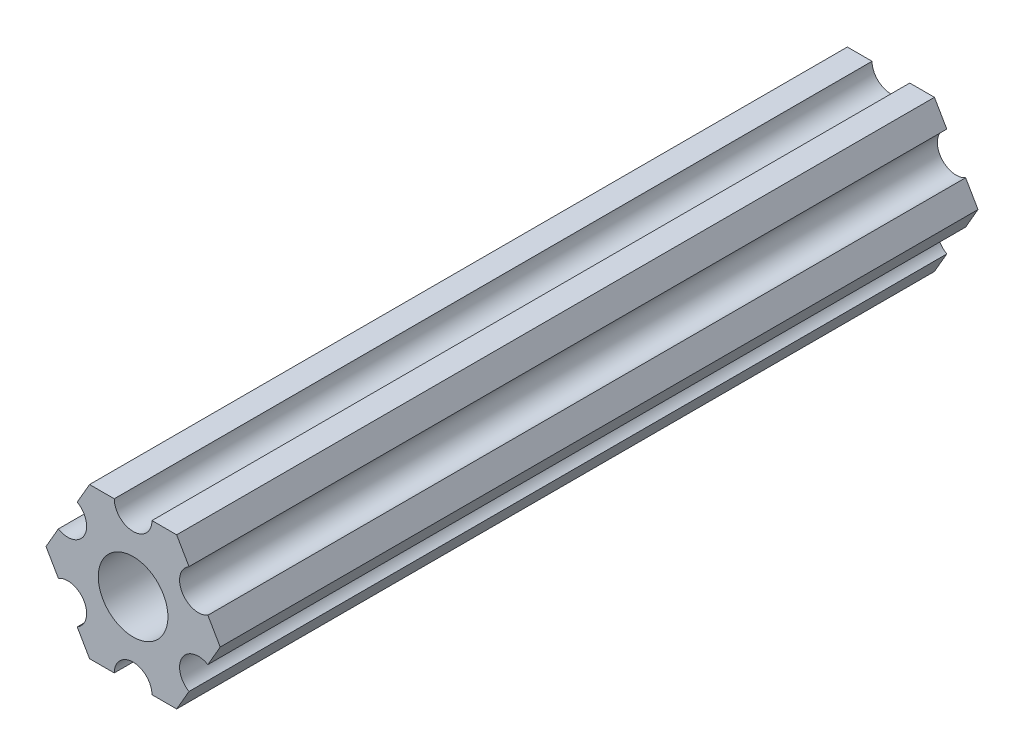
ISO-10303-21;
HEADER;
FILE_DESCRIPTION(('STEP AP214'),'2;1');
FILE_NAME('part.step','',(''),(''),'','','');
FILE_SCHEMA(('AUTOMOTIVE_DESIGN { 1 0 10303 214 1 1 1 1 }'));
ENDSEC;
DATA;
#1=APPLICATION_CONTEXT('core data for automotive mechanical design processes');
#2=APPLICATION_PROTOCOL_DEFINITION('international standard','automotive_design',2000,#1);
#3=PRODUCT_CONTEXT('',#1,'mechanical');
#4=PRODUCT('Part','Part','',(#3));
#5=PRODUCT_RELATED_PRODUCT_CATEGORY('part','',(#4));
#6=PRODUCT_DEFINITION_FORMATION('','',#4);
#7=PRODUCT_DEFINITION_CONTEXT('part definition',#1,'design');
#8=PRODUCT_DEFINITION('design','',#6,#7);
#9=PRODUCT_DEFINITION_SHAPE('','',#8);
#10=(LENGTH_UNIT() NAMED_UNIT(*) SI_UNIT(.MILLI.,.METRE.));
#11=(NAMED_UNIT(*) PLANE_ANGLE_UNIT() SI_UNIT($,.RADIAN.));
#12=(NAMED_UNIT(*) SI_UNIT($,.STERADIAN.) SOLID_ANGLE_UNIT());
#13=UNCERTAINTY_MEASURE_WITH_UNIT(LENGTH_MEASURE(1.E-05),#10,'distance_accuracy_value','');
#14=(GEOMETRIC_REPRESENTATION_CONTEXT(3) GLOBAL_UNCERTAINTY_ASSIGNED_CONTEXT((#13)) GLOBAL_UNIT_ASSIGNED_CONTEXT((#10,
#11,#12)) REPRESENTATION_CONTEXT('',''));
#15=CARTESIAN_POINT('',(0.,0.,0.));
#16=DIRECTION('',(0.,0.,1.));
#17=DIRECTION('',(1.,0.,0.));
#18=AXIS2_PLACEMENT_3D('',#15,#16,#17);
#19=CARTESIAN_POINT('',(5.49926150638083,-3.17499966684068,63.79));
#20=DIRECTION('',(0.,0.,-1.));
#21=DIRECTION('',(-1.,0.,0.));
#22=AXIS2_PLACEMENT_3D('',#19,#20,#21);
#23=CYLINDRICAL_SURFACE('',#22,1.58750000000001);
#24=CARTESIAN_POINT('',(5.49926150638083,-3.17499966684068,0.));
#25=DIRECTION('',(0.,0.,1.));
#26=DIRECTION('',(1.,0.,0.));
#27=AXIS2_PLACEMENT_3D('',#24,#25,#26);
#28=CIRCLE('',#27,1.58750000000001);
#29=CARTESIAN_POINT('',(6.29301142309098,-1.80018429024546,0.));
#30=VERTEX_POINT('',#29);
#31=CARTESIAN_POINT('',(4.70551158967068,-4.54981504343589,0.));
#32=VERTEX_POINT('',#31);
#33=EDGE_CURVE('E190',#30,#32,#28,.T.);
#34=ORIENTED_EDGE('',*,*,#33,.F.);
#35=DIRECTION('',(0.,0.,-1.));
#36=VECTOR('',#35,1.);
#37=CARTESIAN_POINT('',(6.29301142309098,-1.80018429024546,63.79));
#38=LINE('',#37,#36);
#39=CARTESIAN_POINT('',(6.29301142309098,-1.80018429024546,63.79));
#40=VERTEX_POINT('',#39);
#41=EDGE_CURVE('E11',#40,#30,#38,.T.);
#42=ORIENTED_EDGE('',*,*,#41,.F.);
#43=CARTESIAN_POINT('',(5.49926150638083,-3.17499966684068,63.79));
#44=DIRECTION('',(0.,0.,1.));
#45=DIRECTION('',(1.,0.,0.));
#46=AXIS2_PLACEMENT_3D('',#43,#44,#45);
#47=CIRCLE('',#46,1.58750000000001);
#48=CARTESIAN_POINT('',(4.70551158967068,-4.54981504343589,63.79));
#49=VERTEX_POINT('',#48);
#50=EDGE_CURVE('E241',#40,#49,#47,.T.);
#51=ORIENTED_EDGE('',*,*,#50,.T.);
#52=DIRECTION('',(0.,0.,-1.));
#53=VECTOR('',#52,1.);
#54=CARTESIAN_POINT('',(4.70551158967068,-4.54981504343589,63.79));
#55=LINE('',#54,#53);
#56=EDGE_CURVE('E36',#49,#32,#55,.T.);
#57=ORIENTED_EDGE('',*,*,#56,.T.);
#58=EDGE_LOOP('',(#34,#42,#51,#57));
#59=FACE_BOUND('',#58,.T.);
#60=ADVANCED_FACE('F33',(#59),#23,.F.);
#61=CARTESIAN_POINT('',(7.33234841870826,4.44212518856872E-07,63.79));
#62=DIRECTION('',(0.866025434075723,-0.499999947533953,0.));
#63=DIRECTION('',(0.499999947533953,0.866025434075723,0.));
#64=AXIS2_PLACEMENT_3D('',#61,#62,#63);
#65=PLANE('',#64);
#66=DIRECTION('',(-0.499999947533953,-0.866025434075723,0.));
#67=VECTOR('',#66,1.);
#68=CARTESIAN_POINT('',(7.33234841870826,4.44212518856872E-07,0.));
#69=LINE('',#68,#67);
#70=CARTESIAN_POINT('',(7.33234841870826,4.44212518856872E-07,0.));
#71=VERTEX_POINT('',#70);
#72=EDGE_CURVE('E239',#71,#30,#69,.T.);
#73=ORIENTED_EDGE('',*,*,#72,.F.);
#74=DIRECTION('',(0.,0.,-1.));
#75=VECTOR('',#74,1.);
#76=CARTESIAN_POINT('',(7.33234841870826,4.44212518856872E-07,63.79));
#77=LINE('',#76,#75);
#78=CARTESIAN_POINT('',(7.33234841870826,4.44212518856872E-07,63.79));
#79=VERTEX_POINT('',#78);
#80=EDGE_CURVE('E42',#79,#71,#77,.T.);
#81=ORIENTED_EDGE('',*,*,#80,.F.);
#82=DIRECTION('',(-0.499999947533953,-0.866025434075723,0.));
#83=VECTOR('',#82,1.);
#84=CARTESIAN_POINT('',(7.33234841870826,4.44212518856872E-07,63.79));
#85=LINE('',#84,#83);
#86=EDGE_CURVE('E180',#79,#40,#85,.T.);
#87=ORIENTED_EDGE('',*,*,#86,.T.);
#88=ORIENTED_EDGE('',*,*,#41,.T.);
#89=EDGE_LOOP('',(#73,#81,#87,#88));
#90=FACE_BOUND('',#89,.T.);
#91=ADVANCED_FACE('F273',(#90),#65,.T.);
#92=CARTESIAN_POINT('',(6.29301120497139,1.80018505273895,63.79));
#93=DIRECTION('',(0.866025373493145,0.500000052466056,0.));
#94=DIRECTION('',(-0.500000052466056,0.866025373493145,0.));
#95=AXIS2_PLACEMENT_3D('',#92,#93,#94);
#96=PLANE('',#95);
#97=DIRECTION('',(0.500000052466056,-0.866025373493145,0.));
#98=VECTOR('',#97,1.);
#99=CARTESIAN_POINT('',(6.29301120497139,1.80018505273895,0.));
#100=LINE('',#99,#98);
#101=CARTESIAN_POINT('',(6.29301120497139,1.80018505273895,0.));
#102=VERTEX_POINT('',#101);
#103=EDGE_CURVE('E167',#102,#71,#100,.T.);
#104=ORIENTED_EDGE('',*,*,#103,.F.);
#105=DIRECTION('',(0.,0.,-1.));
#106=VECTOR('',#105,1.);
#107=CARTESIAN_POINT('',(6.29301120497139,1.80018505273895,63.79));
#108=LINE('',#107,#106);
#109=CARTESIAN_POINT('',(6.29301120497139,1.80018505273895,63.79));
#110=VERTEX_POINT('',#109);
#111=EDGE_CURVE('E162',#110,#102,#108,.T.);
#112=ORIENTED_EDGE('',*,*,#111,.F.);
#113=DIRECTION('',(0.500000052466056,-0.866025373493145,0.));
#114=VECTOR('',#113,1.);
#115=CARTESIAN_POINT('',(6.29301120497139,1.80018505273895,63.79));
#116=LINE('',#115,#114);
#117=EDGE_CURVE('E165',#110,#79,#116,.T.);
#118=ORIENTED_EDGE('',*,*,#117,.T.);
#119=ORIENTED_EDGE('',*,*,#80,.T.);
#120=EDGE_LOOP('',(#104,#112,#118,#119));
#121=FACE_BOUND('',#120,.T.);
#122=ADVANCED_FACE('F164',(#121),#96,.T.);
#123=CARTESIAN_POINT('',(5.49926112168152,3.17500033315931,63.79));
#124=DIRECTION('',(0.,0.,-1.));
#125=DIRECTION('',(-1.,0.,0.));
#126=AXIS2_PLACEMENT_3D('',#123,#124,#125);
#127=CYLINDRICAL_SURFACE('',#126,1.5875);
#128=CARTESIAN_POINT('',(5.49926112168152,3.17500033315931,0.));
#129=DIRECTION('',(0.,0.,1.));
#130=DIRECTION('',(1.,0.,0.));
#131=AXIS2_PLACEMENT_3D('',#128,#129,#130);
#132=CIRCLE('',#131,1.5875);
#133=CARTESIAN_POINT('',(4.70551103839166,4.54981561357968,0.));
#134=VERTEX_POINT('',#133);
#135=EDGE_CURVE('E236',#134,#102,#132,.T.);
#136=ORIENTED_EDGE('',*,*,#135,.F.);
#137=DIRECTION('',(0.,0.,-1.));
#138=VECTOR('',#137,1.);
#139=CARTESIAN_POINT('',(4.70551103839166,4.54981561357968,63.79));
#140=LINE('',#139,#138);
#141=CARTESIAN_POINT('',(4.70551103839166,4.54981561357968,63.79));
#142=VERTEX_POINT('',#141);
#143=EDGE_CURVE('E172',#142,#134,#140,.T.);
#144=ORIENTED_EDGE('',*,*,#143,.F.);
#145=CARTESIAN_POINT('',(5.49926112168152,3.17500033315931,63.79));
#146=DIRECTION('',(0.,0.,1.));
#147=DIRECTION('',(1.,0.,0.));
#148=AXIS2_PLACEMENT_3D('',#145,#146,#147);
#149=CIRCLE('',#148,1.5875);
#150=EDGE_CURVE('E178',#142,#110,#149,.T.);
#151=ORIENTED_EDGE('',*,*,#150,.T.);
#152=ORIENTED_EDGE('',*,*,#111,.T.);
#153=EDGE_LOOP('',(#136,#144,#151,#152));
#154=FACE_BOUND('',#153,.T.);
#155=ADVANCED_FACE('F182',(#154),#127,.F.);
#156=CARTESIAN_POINT('',(3.66617382465472,6.35000022210622,63.79));
#157=DIRECTION('',(0.866025373493145,0.500000052466056,0.));
#158=DIRECTION('',(-0.500000052466056,0.866025373493145,0.));
#159=AXIS2_PLACEMENT_3D('',#156,#157,#158);
#160=PLANE('',#159);
#161=DIRECTION('',(0.500000052466056,-0.866025373493145,0.));
#162=VECTOR('',#161,1.);
#163=CARTESIAN_POINT('',(3.66617382465472,6.35000022210622,0.));
#164=LINE('',#163,#162);
#165=CARTESIAN_POINT('',(3.66617382465472,6.35000022210622,0.));
#166=VERTEX_POINT('',#165);
#167=EDGE_CURVE('E233',#166,#134,#164,.T.);
#168=ORIENTED_EDGE('',*,*,#167,.F.);
#169=DIRECTION('',(0.,0.,-1.));
#170=VECTOR('',#169,1.);
#171=CARTESIAN_POINT('',(3.66617382465472,6.35000022210622,63.79));
#172=LINE('',#171,#170);
#173=CARTESIAN_POINT('',(3.66617382465472,6.35000022210622,63.79));
#174=VERTEX_POINT('',#173);
#175=EDGE_CURVE('E245',#174,#166,#172,.T.);
#176=ORIENTED_EDGE('',*,*,#175,.F.);
#177=DIRECTION('',(0.500000052466056,-0.866025373493145,0.));
#178=VECTOR('',#177,1.);
#179=CARTESIAN_POINT('',(3.66617382465472,6.35000022210622,63.79));
#180=LINE('',#179,#178);
#181=EDGE_CURVE('E183',#174,#142,#180,.T.);
#182=ORIENTED_EDGE('',*,*,#181,.T.);
#183=ORIENTED_EDGE('',*,*,#143,.T.);
#184=EDGE_LOOP('',(#168,#176,#182,#183));
#185=FACE_BOUND('',#184,.T.);
#186=ADVANCED_FACE('F286',(#185),#160,.T.);
#187=CARTESIAN_POINT('',(1.58749961530066,6.35000022210623,63.79));
#188=DIRECTION('',(0.,1.,0.));
#189=DIRECTION('',(-1.,0.,0.));
#190=AXIS2_PLACEMENT_3D('',#187,#188,#189);
#191=PLANE('',#190);
#192=DIRECTION('',(1.,0.,0.));
#193=VECTOR('',#192,1.);
#194=CARTESIAN_POINT('',(1.58749961530066,6.35000022210623,0.));
#195=LINE('',#194,#193);
#196=CARTESIAN_POINT('',(1.58749961530066,6.35000022210623,0.));
#197=VERTEX_POINT('',#196);
#198=EDGE_CURVE('E230',#197,#166,#195,.T.);
#199=ORIENTED_EDGE('',*,*,#198,.F.);
#200=DIRECTION('',(0.,0.,-1.));
#201=VECTOR('',#200,1.);
#202=CARTESIAN_POINT('',(1.58749961530066,6.35000022210623,63.79));
#203=LINE('',#202,#201);
#204=CARTESIAN_POINT('',(1.58749961530066,6.35000022210623,63.79));
#205=VERTEX_POINT('',#204);
#206=EDGE_CURVE('E247',#205,#197,#203,.T.);
#207=ORIENTED_EDGE('',*,*,#206,.F.);
#208=DIRECTION('',(1.,0.,0.));
#209=VECTOR('',#208,1.);
#210=CARTESIAN_POINT('',(1.58749961530066,6.35000022210623,63.79));
#211=LINE('',#210,#209);
#212=EDGE_CURVE('E185',#205,#174,#211,.T.);
#213=ORIENTED_EDGE('',*,*,#212,.T.);
#214=ORIENTED_EDGE('',*,*,#175,.T.);
#215=EDGE_LOOP('',(#199,#207,#213,#214));
#216=FACE_BOUND('',#215,.T.);
#217=ADVANCED_FACE('F289',(#216),#191,.T.);
#218=CARTESIAN_POINT('',(-3.84699344941095E-07,6.35000022210623,63.79));
#219=DIRECTION('',(0.,0.,-1.));
#220=DIRECTION('',(-1.,0.,0.));
#221=AXIS2_PLACEMENT_3D('',#218,#219,#220);
#222=CYLINDRICAL_SURFACE('',#221,1.5875);
#223=CARTESIAN_POINT('',(-3.84699344941095E-07,6.35000022210623,0.));
#224=DIRECTION('',(0.,0.,1.));
#225=DIRECTION('',(1.,0.,0.));
#226=AXIS2_PLACEMENT_3D('',#223,#224,#225);
#227=CIRCLE('',#226,1.5875);
#228=CARTESIAN_POINT('',(-1.58750038469935,6.35000022210623,0.));
#229=VERTEX_POINT('',#228);
#230=EDGE_CURVE('E227',#229,#197,#227,.T.);
#231=ORIENTED_EDGE('',*,*,#230,.F.);
#232=DIRECTION('',(0.,0.,-1.));
#233=VECTOR('',#232,1.);
#234=CARTESIAN_POINT('',(-1.58750038469935,6.35000022210623,63.79));
#235=LINE('',#234,#233);
#236=CARTESIAN_POINT('',(-1.58750038469935,6.35000022210623,63.79));
#237=VERTEX_POINT('',#236);
#238=EDGE_CURVE('E249',#237,#229,#235,.T.);
#239=ORIENTED_EDGE('',*,*,#238,.F.);
#240=CARTESIAN_POINT('',(-3.84699344941095E-07,6.35000022210623,63.79));
#241=DIRECTION('',(0.,0.,1.));
#242=DIRECTION('',(1.,0.,0.));
#243=AXIS2_PLACEMENT_3D('',#240,#241,#242);
#244=CIRCLE('',#243,1.5875);
#245=EDGE_CURVE('E394',#237,#205,#244,.T.);
#246=ORIENTED_EDGE('',*,*,#245,.T.);
#247=ORIENTED_EDGE('',*,*,#206,.T.);
#248=EDGE_LOOP('',(#231,#239,#246,#247));
#249=FACE_BOUND('',#248,.T.);
#250=ADVANCED_FACE('F293',(#249),#222,.F.);
#251=CARTESIAN_POINT('',(-3.66617452134701,6.35000022210623,63.79));
#252=DIRECTION('',(0.,1.,0.));
#253=DIRECTION('',(0.,0.,1.));
#254=AXIS2_PLACEMENT_3D('',#251,#252,#253);
#255=PLANE('',#254);
#256=DIRECTION('',(1.,0.,0.));
#257=VECTOR('',#256,1.);
#258=CARTESIAN_POINT('',(-3.66617452134701,6.35000022210623,0.));
#259=LINE('',#258,#257);
#260=CARTESIAN_POINT('',(-3.66617452134701,6.35000022210623,0.));
#261=VERTEX_POINT('',#260);
#262=EDGE_CURVE('E224',#261,#229,#259,.T.);
#263=ORIENTED_EDGE('',*,*,#262,.F.);
#264=DIRECTION('',(0.,0.,-1.));
#265=VECTOR('',#264,1.);
#266=CARTESIAN_POINT('',(-3.66617452134701,6.35000022210623,63.79));
#267=LINE('',#266,#265);
#268=CARTESIAN_POINT('',(-3.66617452134701,6.35000022210623,63.79));
#269=VERTEX_POINT('',#268);
#270=EDGE_CURVE('E251',#269,#261,#267,.T.);
#271=ORIENTED_EDGE('',*,*,#270,.F.);
#272=DIRECTION('',(1.,0.,0.));
#273=VECTOR('',#272,1.);
#274=CARTESIAN_POINT('',(-3.66617452134701,6.35000022210623,63.79));
#275=LINE('',#274,#273);
#276=EDGE_CURVE('E391',#269,#237,#275,.T.);
#277=ORIENTED_EDGE('',*,*,#276,.T.);
#278=ORIENTED_EDGE('',*,*,#238,.T.);
#279=EDGE_LOOP('',(#263,#271,#277,#278));
#280=FACE_BOUND('',#279,.T.);
#281=ADVANCED_FACE('F297',(#280),#255,.T.);
#282=CARTESIAN_POINT('',(-4.70551145677116,4.54981548085265,63.79));
#283=DIRECTION('',(-0.866025447431971,0.499999924400249,0.));
#284=DIRECTION('',(-0.499999924400249,-0.866025447431971,0.));
#285=AXIS2_PLACEMENT_3D('',#282,#283,#284);
#286=PLANE('',#285);
#287=DIRECTION('',(0.499999924400249,0.866025447431971,0.));
#288=VECTOR('',#287,1.);
#289=CARTESIAN_POINT('',(-4.70551145677116,4.54981548085265,0.));
#290=LINE('',#289,#288);
#291=CARTESIAN_POINT('',(-4.70551145677116,4.54981548085265,0.));
#292=VERTEX_POINT('',#291);
#293=EDGE_CURVE('E221',#292,#261,#290,.T.);
#294=ORIENTED_EDGE('',*,*,#293,.F.);
#295=DIRECTION('',(0.,0.,-1.));
#296=VECTOR('',#295,1.);
#297=CARTESIAN_POINT('',(-4.70551145677116,4.54981548085265,63.79));
#298=LINE('',#297,#296);
#299=CARTESIAN_POINT('',(-4.70551145677116,4.54981548085265,63.79));
#300=VERTEX_POINT('',#299);
#301=EDGE_CURVE('E253',#300,#292,#298,.T.);
#302=ORIENTED_EDGE('',*,*,#301,.F.);
#303=DIRECTION('',(0.499999924400249,0.866025447431971,0.));
#304=VECTOR('',#303,1.);
#305=CARTESIAN_POINT('',(-4.70551145677116,4.54981548085265,63.79));
#306=LINE('',#305,#304);
#307=EDGE_CURVE('E388',#300,#269,#306,.T.);
#308=ORIENTED_EDGE('',*,*,#307,.T.);
#309=ORIENTED_EDGE('',*,*,#270,.T.);
#310=EDGE_LOOP('',(#294,#302,#308,#309));
#311=FACE_BOUND('',#310,.T.);
#312=ADVANCED_FACE('F301',(#311),#286,.T.);
#313=CARTESIAN_POINT('',(-5.49926133675655,3.17500008305439,63.79));
#314=DIRECTION('',(0.,0.,-1.));
#315=DIRECTION('',(-1.,0.,0.));
#316=AXIS2_PLACEMENT_3D('',#313,#314,#315);
#317=CYLINDRICAL_SURFACE('',#316,1.5875);
#318=CARTESIAN_POINT('',(-5.49926133675655,3.17500008305439,0.));
#319=DIRECTION('',(0.,0.,1.));
#320=DIRECTION('',(1.,0.,0.));
#321=AXIS2_PLACEMENT_3D('',#318,#319,#320);
#322=CIRCLE('',#321,1.5875);
#323=CARTESIAN_POINT('',(-6.29301121674195,1.80018468525613,0.));
#324=VERTEX_POINT('',#323);
#325=EDGE_CURVE('E218',#324,#292,#322,.T.);
#326=ORIENTED_EDGE('',*,*,#325,.F.);
#327=DIRECTION('',(0.,0.,-1.));
#328=VECTOR('',#327,1.);
#329=CARTESIAN_POINT('',(-6.29301121674195,1.80018468525613,63.79));
#330=LINE('',#329,#328);
#331=CARTESIAN_POINT('',(-6.29301121674195,1.80018468525613,63.79));
#332=VERTEX_POINT('',#331);
#333=EDGE_CURVE('E255',#332,#324,#330,.T.);
#334=ORIENTED_EDGE('',*,*,#333,.F.);
#335=CARTESIAN_POINT('',(-5.49926133675655,3.17500008305439,63.79));
#336=DIRECTION('',(0.,0.,1.));
#337=DIRECTION('',(1.,0.,0.));
#338=AXIS2_PLACEMENT_3D('',#335,#336,#337);
#339=CIRCLE('',#338,1.5875);
#340=EDGE_CURVE('E385',#332,#300,#339,.T.);
#341=ORIENTED_EDGE('',*,*,#340,.T.);
#342=ORIENTED_EDGE('',*,*,#301,.T.);
#343=EDGE_LOOP('',(#326,#334,#341,#342));
#344=FACE_BOUND('',#343,.T.);
#345=ADVANCED_FACE('F305',(#344),#317,.F.);
#346=CARTESIAN_POINT('',(-7.33234807945963,6.99338729030344E-08,63.79));
#347=DIRECTION('',(-0.866025447431971,0.499999924400249,0.));
#348=DIRECTION('',(-0.499999924400249,-0.866025447431971,0.));
#349=AXIS2_PLACEMENT_3D('',#346,#347,#348);
#350=PLANE('',#349);
#351=DIRECTION('',(0.499999924400249,0.866025447431971,0.));
#352=VECTOR('',#351,1.);
#353=CARTESIAN_POINT('',(-7.33234807945963,6.99338729030344E-08,0.));
#354=LINE('',#353,#352);
#355=CARTESIAN_POINT('',(-7.33234807945963,6.99338729030344E-08,0.));
#356=VERTEX_POINT('',#355);
#357=EDGE_CURVE('E215',#356,#324,#354,.T.);
#358=ORIENTED_EDGE('',*,*,#357,.F.);
#359=DIRECTION('',(0.,0.,-1.));
#360=VECTOR('',#359,1.);
#361=CARTESIAN_POINT('',(-7.33234807945963,6.99338729030344E-08,63.79));
#362=LINE('',#361,#360);
#363=CARTESIAN_POINT('',(-7.33234807945963,6.99338729030344E-08,63.79));
#364=VERTEX_POINT('',#363);
#365=EDGE_CURVE('E257',#364,#356,#362,.T.);
#366=ORIENTED_EDGE('',*,*,#365,.F.);
#367=DIRECTION('',(0.499999924400249,0.866025447431971,0.));
#368=VECTOR('',#367,1.);
#369=CARTESIAN_POINT('',(-7.33234807945963,6.99338729030344E-08,63.79));
#370=LINE('',#369,#368);
#371=EDGE_CURVE('E382',#364,#332,#370,.T.);
#372=ORIENTED_EDGE('',*,*,#371,.T.);
#373=ORIENTED_EDGE('',*,*,#333,.T.);
#374=EDGE_LOOP('',(#358,#366,#372,#373));
#375=FACE_BOUND('',#374,.T.);
#376=ADVANCED_FACE('F309',(#375),#350,.T.);
#377=CARTESIAN_POINT('',(-6.29301096189761,-1.80018459411914,63.79));
#378=DIRECTION('',(-0.866025400205645,-0.500000006198653,0.));
#379=DIRECTION('',(0.500000006198653,-0.866025400205645,0.));
#380=AXIS2_PLACEMENT_3D('',#377,#378,#379);
#381=PLANE('',#380);
#382=DIRECTION('',(-0.500000006198653,0.866025400205645,0.));
#383=VECTOR('',#382,1.);
#384=CARTESIAN_POINT('',(-6.29301096189761,-1.80018459411914,0.));
#385=LINE('',#384,#383);
#386=CARTESIAN_POINT('',(-6.29301096189761,-1.80018459411914,0.));
#387=VERTEX_POINT('',#386);
#388=EDGE_CURVE('E212',#387,#356,#385,.T.);
#389=ORIENTED_EDGE('',*,*,#388,.F.);
#390=DIRECTION('',(0.,0.,-1.));
#391=VECTOR('',#390,1.);
#392=CARTESIAN_POINT('',(-6.29301096189761,-1.80018459411914,63.79));
#393=LINE('',#392,#391);
#394=CARTESIAN_POINT('',(-6.29301096189761,-1.80018459411914,63.79));
#395=VERTEX_POINT('',#394);
#396=EDGE_CURVE('E259',#395,#387,#393,.T.);
#397=ORIENTED_EDGE('',*,*,#396,.F.);
#398=DIRECTION('',(-0.500000006198653,0.866025400205645,0.));
#399=VECTOR('',#398,1.);
#400=CARTESIAN_POINT('',(-6.29301096189761,-1.80018459411914,63.79));
#401=LINE('',#400,#399);
#402=EDGE_CURVE('E379',#395,#364,#401,.T.);
#403=ORIENTED_EDGE('',*,*,#402,.T.);
#404=ORIENTED_EDGE('',*,*,#365,.T.);
#405=EDGE_LOOP('',(#389,#397,#403,#404));
#406=FACE_BOUND('',#405,.T.);
#407=ADVANCED_FACE('F313',(#406),#381,.T.);
#408=CARTESIAN_POINT('',(-5.49926095205725,-3.1749999169456,63.79));
#409=DIRECTION('',(0.,0.,-1.));
#410=DIRECTION('',(-1.,0.,0.));
#411=AXIS2_PLACEMENT_3D('',#408,#409,#410);
#412=CYLINDRICAL_SURFACE('',#411,1.5875);
#413=CARTESIAN_POINT('',(-5.49926095205725,-3.1749999169456,0.));
#414=DIRECTION('',(0.,0.,1.));
#415=DIRECTION('',(1.,0.,0.));
#416=AXIS2_PLACEMENT_3D('',#413,#414,#415);
#417=CIRCLE('',#416,1.5875);
#418=CARTESIAN_POINT('',(-4.70551094221689,-4.54981523977206,0.));
#419=VERTEX_POINT('',#418);
#420=EDGE_CURVE('E209',#419,#387,#417,.T.);
#421=ORIENTED_EDGE('',*,*,#420,.F.);
#422=DIRECTION('',(0.,0.,-1.));
#423=VECTOR('',#422,1.);
#424=CARTESIAN_POINT('',(-4.70551094221689,-4.54981523977206,63.79));
#425=LINE('',#424,#423);
#426=CARTESIAN_POINT('',(-4.70551094221689,-4.54981523977206,63.79));
#427=VERTEX_POINT('',#426);
#428=EDGE_CURVE('E261',#427,#419,#425,.T.);
#429=ORIENTED_EDGE('',*,*,#428,.F.);
#430=CARTESIAN_POINT('',(-5.49926095205725,-3.1749999169456,63.79));
#431=DIRECTION('',(0.,0.,1.));
#432=DIRECTION('',(1.,0.,0.));
#433=AXIS2_PLACEMENT_3D('',#430,#431,#432);
#434=CIRCLE('',#433,1.5875);
#435=EDGE_CURVE('E376',#427,#395,#434,.T.);
#436=ORIENTED_EDGE('',*,*,#435,.T.);
#437=ORIENTED_EDGE('',*,*,#396,.T.);
#438=EDGE_LOOP('',(#421,#429,#436,#437));
#439=FACE_BOUND('',#438,.T.);
#440=ADVANCED_FACE('F317',(#439),#412,.F.);
#441=CARTESIAN_POINT('',(-3.66617382465481,-6.34999990382519,63.79));
#442=DIRECTION('',(-0.866025400205645,-0.500000006198653,0.));
#443=DIRECTION('',(0.500000006198653,-0.866025400205645,0.));
#444=AXIS2_PLACEMENT_3D('',#441,#442,#443);
#445=PLANE('',#444);
#446=DIRECTION('',(-0.500000006198653,0.866025400205644,0.));
#447=VECTOR('',#446,1.);
#448=CARTESIAN_POINT('',(-3.66617382465481,-6.34999990382519,0.));
#449=LINE('',#448,#447);
#450=CARTESIAN_POINT('',(-3.66617382465481,-6.34999990382519,0.));
#451=VERTEX_POINT('',#450);
#452=EDGE_CURVE('E206',#451,#419,#449,.T.);
#453=ORIENTED_EDGE('',*,*,#452,.F.);
#454=DIRECTION('',(0.,0.,-1.));
#455=VECTOR('',#454,1.);
#456=CARTESIAN_POINT('',(-3.66617382465481,-6.34999990382519,63.79));
#457=LINE('',#456,#455);
#458=CARTESIAN_POINT('',(-3.66617382465481,-6.34999990382519,63.79));
#459=VERTEX_POINT('',#458);
#460=EDGE_CURVE('E263',#459,#451,#457,.T.);
#461=ORIENTED_EDGE('',*,*,#460,.F.);
#462=DIRECTION('',(-0.500000006198653,0.866025400205644,0.));
#463=VECTOR('',#462,1.);
#464=CARTESIAN_POINT('',(-3.66617382465481,-6.34999990382519,63.79));
#465=LINE('',#464,#463);
#466=EDGE_CURVE('E373',#459,#427,#465,.T.);
#467=ORIENTED_EDGE('',*,*,#466,.T.);
#468=ORIENTED_EDGE('',*,*,#428,.T.);
#469=EDGE_LOOP('',(#453,#461,#467,#468));
#470=FACE_BOUND('',#469,.T.);
#471=ADVANCED_FACE('F321',(#470),#445,.T.);
#472=CARTESIAN_POINT('',(-1.58749961530074,-6.34999990382519,63.79));
#473=DIRECTION('',(0.,-1.,0.));
#474=DIRECTION('',(1.,0.,0.));
#475=AXIS2_PLACEMENT_3D('',#472,#473,#474);
#476=PLANE('',#475);
#477=DIRECTION('',(-1.,0.,0.));
#478=VECTOR('',#477,1.);
#479=CARTESIAN_POINT('',(-1.58749961530074,-6.34999990382519,0.));
#480=LINE('',#479,#478);
#481=CARTESIAN_POINT('',(-1.58749961530074,-6.34999990382519,0.));
#482=VERTEX_POINT('',#481);
#483=EDGE_CURVE('E203',#482,#451,#480,.T.);
#484=ORIENTED_EDGE('',*,*,#483,.F.);
#485=DIRECTION('',(0.,0.,-1.));
#486=VECTOR('',#485,1.);
#487=CARTESIAN_POINT('',(-1.58749961530074,-6.34999990382519,63.79));
#488=LINE('',#487,#486);
#489=CARTESIAN_POINT('',(-1.58749961530074,-6.34999990382519,63.79));
#490=VERTEX_POINT('',#489);
#491=EDGE_CURVE('E265',#490,#482,#488,.T.);
#492=ORIENTED_EDGE('',*,*,#491,.F.);
#493=DIRECTION('',(-1.,0.,0.));
#494=VECTOR('',#493,1.);
#495=CARTESIAN_POINT('',(-1.58749961530074,-6.34999990382519,63.79));
#496=LINE('',#495,#494);
#497=EDGE_CURVE('E370',#490,#459,#496,.T.);
#498=ORIENTED_EDGE('',*,*,#497,.T.);
#499=ORIENTED_EDGE('',*,*,#460,.T.);
#500=EDGE_LOOP('',(#484,#492,#498,#499));
#501=FACE_BOUND('',#500,.T.);
#502=ADVANCED_FACE('F325',(#501),#476,.T.);
#503=CARTESIAN_POINT('',(3.8469926204343E-07,-6.34999990382519,63.79));
#504=DIRECTION('',(0.,0.,-1.));
#505=DIRECTION('',(-1.,0.,0.));
#506=AXIS2_PLACEMENT_3D('',#503,#504,#505);
#507=CYLINDRICAL_SURFACE('',#506,1.5875);
#508=CARTESIAN_POINT('',(3.8469926204343E-07,-6.34999990382519,0.));
#509=DIRECTION('',(0.,0.,1.));
#510=DIRECTION('',(1.,0.,0.));
#511=AXIS2_PLACEMENT_3D('',#508,#509,#510);
#512=CIRCLE('',#511,1.5875);
#513=CARTESIAN_POINT('',(1.58750038469926,-6.34999990382518,0.));
#514=VERTEX_POINT('',#513);
#515=EDGE_CURVE('E200',#514,#482,#512,.T.);
#516=ORIENTED_EDGE('',*,*,#515,.F.);
#517=DIRECTION('',(0.,0.,-1.));
#518=VECTOR('',#517,1.);
#519=CARTESIAN_POINT('',(1.58750038469926,-6.34999990382518,63.79));
#520=LINE('',#519,#518);
#521=CARTESIAN_POINT('',(1.58750038469926,-6.34999990382518,63.79));
#522=VERTEX_POINT('',#521);
#523=EDGE_CURVE('E267',#522,#514,#520,.T.);
#524=ORIENTED_EDGE('',*,*,#523,.F.);
#525=CARTESIAN_POINT('',(3.8469926204343E-07,-6.34999990382519,63.79));
#526=DIRECTION('',(0.,0.,1.));
#527=DIRECTION('',(1.,0.,0.));
#528=AXIS2_PLACEMENT_3D('',#525,#526,#527);
#529=CIRCLE('',#528,1.5875);
#530=EDGE_CURVE('E367',#522,#490,#529,.T.);
#531=ORIENTED_EDGE('',*,*,#530,.T.);
#532=ORIENTED_EDGE('',*,*,#491,.T.);
#533=EDGE_LOOP('',(#516,#524,#531,#532));
#534=FACE_BOUND('',#533,.T.);
#535=ADVANCED_FACE('F329',(#534),#507,.F.);
#536=CARTESIAN_POINT('',(3.66617452134693,-6.34999990382519,63.79));
#537=DIRECTION('',(0.,-1.,0.));
#538=DIRECTION('',(1.,0.,0.));
#539=AXIS2_PLACEMENT_3D('',#536,#537,#538);
#540=PLANE('',#539);
#541=DIRECTION('',(-1.,0.,0.));
#542=VECTOR('',#541,1.);
#543=CARTESIAN_POINT('',(3.66617452134693,-6.34999990382519,0.));
#544=LINE('',#543,#542);
#545=CARTESIAN_POINT('',(3.66617452134693,-6.34999990382519,0.));
#546=VERTEX_POINT('',#545);
#547=EDGE_CURVE('E197',#546,#514,#544,.T.);
#548=ORIENTED_EDGE('',*,*,#547,.F.);
#549=DIRECTION('',(0.,0.,-1.));
#550=VECTOR('',#549,1.);
#551=CARTESIAN_POINT('',(3.66617452134693,-6.34999990382519,63.79));
#552=LINE('',#551,#550);
#553=CARTESIAN_POINT('',(3.66617452134693,-6.34999990382519,63.79));
#554=VERTEX_POINT('',#553);
#555=EDGE_CURVE('E268',#554,#546,#552,.T.);
#556=ORIENTED_EDGE('',*,*,#555,.F.);
#557=DIRECTION('',(-1.,0.,0.));
#558=VECTOR('',#557,1.);
#559=CARTESIAN_POINT('',(3.66617452134693,-6.34999990382519,63.79));
#560=LINE('',#559,#558);
#561=EDGE_CURVE('E364',#554,#522,#560,.T.);
#562=ORIENTED_EDGE('',*,*,#561,.T.);
#563=ORIENTED_EDGE('',*,*,#523,.T.);
#564=EDGE_LOOP('',(#548,#556,#562,#563));
#565=FACE_BOUND('',#564,.T.);
#566=ADVANCED_FACE('F333',(#565),#540,.T.);
#567=CARTESIAN_POINT('',(4.70551158967068,-4.54981504343589,63.79));
#568=DIRECTION('',(0.866025434075723,-0.499999947533953,0.));
#569=DIRECTION('',(0.499999947533953,0.866025434075723,0.));
#570=AXIS2_PLACEMENT_3D('',#567,#568,#569);
#571=PLANE('',#570);
#572=DIRECTION('',(-0.499999947533953,-0.866025434075723,0.));
#573=VECTOR('',#572,1.);
#574=CARTESIAN_POINT('',(4.70551158967068,-4.54981504343589,0.));
#575=LINE('',#574,#573);
#576=EDGE_CURVE('E193',#32,#546,#575,.T.);
#577=ORIENTED_EDGE('',*,*,#576,.F.);
#578=ORIENTED_EDGE('',*,*,#56,.F.);
#579=DIRECTION('',(-0.499999947533953,-0.866025434075723,0.));
#580=VECTOR('',#579,1.);
#581=CARTESIAN_POINT('',(4.70551158967068,-4.54981504343589,63.79));
#582=LINE('',#581,#580);
#583=EDGE_CURVE('E362',#49,#554,#582,.T.);
#584=ORIENTED_EDGE('',*,*,#583,.T.);
#585=ORIENTED_EDGE('',*,*,#555,.T.);
#586=EDGE_LOOP('',(#577,#578,#584,#585));
#587=FACE_BOUND('',#586,.T.);
#588=ADVANCED_FACE('F270',(#587),#571,.T.);
#589=CARTESIAN_POINT('',(5.49926150638083,-3.17499966684068,63.79));
#590=DIRECTION('',(0.,0.,1.));
#591=DIRECTION('',(1.,0.,0.));
#592=AXIS2_PLACEMENT_3D('',#589,#590,#591);
#593=PLANE('',#592);
#594=CARTESIAN_POINT('',(0.,0.,63.79));
#595=DIRECTION('',(0.,0.,-1.));
#596=DIRECTION('',(1.,0.,0.));
#597=AXIS2_PLACEMENT_3D('',#594,#595,#596);
#598=CIRCLE('',#597,2.9337);
#599=CARTESIAN_POINT('',(2.9337,0.,63.79));
#600=VERTEX_POINT('',#599);
#601=EDGE_CURVE('E194',#600,#600,#598,.T.);
#602=ORIENTED_EDGE('',*,*,#601,.T.);
#603=EDGE_LOOP('',(#602));
#604=FACE_BOUND('',#603,.T.);
#605=ORIENTED_EDGE('',*,*,#50,.F.);
#606=ORIENTED_EDGE('',*,*,#86,.F.);
#607=ORIENTED_EDGE('',*,*,#117,.F.);
#608=ORIENTED_EDGE('',*,*,#150,.F.);
#609=ORIENTED_EDGE('',*,*,#181,.F.);
#610=ORIENTED_EDGE('',*,*,#212,.F.);
#611=ORIENTED_EDGE('',*,*,#245,.F.);
#612=ORIENTED_EDGE('',*,*,#276,.F.);
#613=ORIENTED_EDGE('',*,*,#307,.F.);
#614=ORIENTED_EDGE('',*,*,#340,.F.);
#615=ORIENTED_EDGE('',*,*,#371,.F.);
#616=ORIENTED_EDGE('',*,*,#402,.F.);
#617=ORIENTED_EDGE('',*,*,#435,.F.);
#618=ORIENTED_EDGE('',*,*,#466,.F.);
#619=ORIENTED_EDGE('',*,*,#497,.F.);
#620=ORIENTED_EDGE('',*,*,#530,.F.);
#621=ORIENTED_EDGE('',*,*,#561,.F.);
#622=ORIENTED_EDGE('',*,*,#583,.F.);
#623=EDGE_LOOP('',(#605,#606,#607,#608,#609,#610,#611,#612,#613,#614,#615,#616,#617,#618,#619,
#620,#621,#622));
#624=FACE_BOUND('',#623,.T.);
#625=ADVANCED_FACE('F176',(#604,#624),#593,.T.);
#626=CARTESIAN_POINT('',(5.49926150638083,-3.17499966684068,0.));
#627=DIRECTION('',(0.,0.,1.));
#628=DIRECTION('',(1.,0.,0.));
#629=AXIS2_PLACEMENT_3D('',#626,#627,#628);
#630=PLANE('',#629);
#631=CARTESIAN_POINT('',(0.,0.,0.));
#632=DIRECTION('',(0.,0.,-1.));
#633=DIRECTION('',(1.,0.,0.));
#634=AXIS2_PLACEMENT_3D('',#631,#632,#633);
#635=CIRCLE('',#634,2.9337);
#636=CARTESIAN_POINT('',(2.9337,0.,0.));
#637=VERTEX_POINT('',#636);
#638=EDGE_CURVE('E357',#637,#637,#635,.T.);
#639=ORIENTED_EDGE('',*,*,#638,.F.);
#640=EDGE_LOOP('',(#639));
#641=FACE_BOUND('',#640,.T.);
#642=ORIENTED_EDGE('',*,*,#33,.T.);
#643=ORIENTED_EDGE('',*,*,#576,.T.);
#644=ORIENTED_EDGE('',*,*,#547,.T.);
#645=ORIENTED_EDGE('',*,*,#515,.T.);
#646=ORIENTED_EDGE('',*,*,#483,.T.);
#647=ORIENTED_EDGE('',*,*,#452,.T.);
#648=ORIENTED_EDGE('',*,*,#420,.T.);
#649=ORIENTED_EDGE('',*,*,#388,.T.);
#650=ORIENTED_EDGE('',*,*,#357,.T.);
#651=ORIENTED_EDGE('',*,*,#325,.T.);
#652=ORIENTED_EDGE('',*,*,#293,.T.);
#653=ORIENTED_EDGE('',*,*,#262,.T.);
#654=ORIENTED_EDGE('',*,*,#230,.T.);
#655=ORIENTED_EDGE('',*,*,#198,.T.);
#656=ORIENTED_EDGE('',*,*,#167,.T.);
#657=ORIENTED_EDGE('',*,*,#135,.T.);
#658=ORIENTED_EDGE('',*,*,#103,.T.);
#659=ORIENTED_EDGE('',*,*,#72,.T.);
#660=EDGE_LOOP('',(#642,#643,#644,#645,#646,#647,#648,#649,#650,#651,#652,#653,#654,#655,#656,
#657,#658,#659));
#661=FACE_BOUND('',#660,.T.);
#662=ADVANCED_FACE('F272',(#641,#661),#630,.F.);
#663=CARTESIAN_POINT('',(0.,0.,63.79));
#664=DIRECTION('',(0.,0.,-1.));
#665=DIRECTION('',(-1.,0.,0.));
#666=AXIS2_PLACEMENT_3D('',#663,#664,#665);
#667=CYLINDRICAL_SURFACE('',#666,2.9337);
#668=ORIENTED_EDGE('',*,*,#601,.F.);
#669=EDGE_LOOP('',(#668));
#670=FACE_BOUND('',#669,.T.);
#671=ORIENTED_EDGE('',*,*,#638,.T.);
#672=EDGE_LOOP('',(#671));
#673=FACE_BOUND('',#672,.T.);
#674=ADVANCED_FACE('F345',(#670,#673),#667,.F.);
#675=CLOSED_SHELL('',(#60,#91,#122,#155,#186,#217,#250,#281,#312,#345,#376,#407,#440,#471,#502,
#535,#566,#588,#625,#662,#674));
#676=MANIFOLD_SOLID_BREP('B2',#675);
#677=ADVANCED_BREP_SHAPE_REPRESENTATION('',(#18,#676),#14);
#678=SHAPE_DEFINITION_REPRESENTATION(#9,#677);
ENDSEC;
END-ISO-10303-21;
